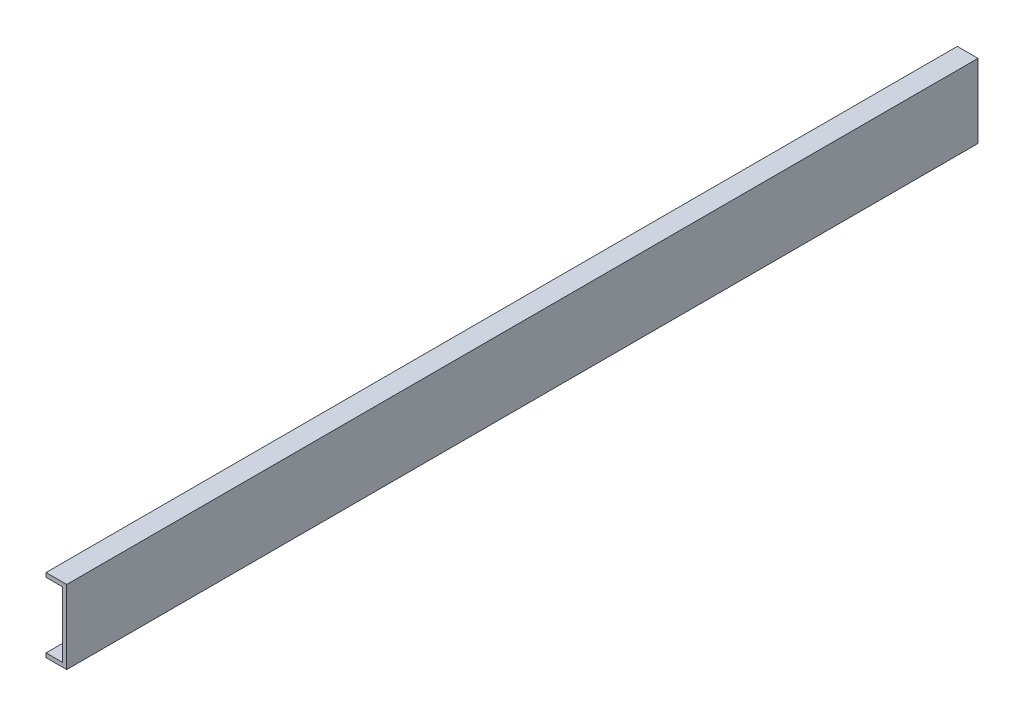
ISO-10303-21;
HEADER;
FILE_DESCRIPTION(('STEP AP214'),'2;1');
FILE_NAME('part.step','',(''),(''),'','','');
FILE_SCHEMA(('AUTOMOTIVE_DESIGN { 1 0 10303 214 1 1 1 1 }'));
ENDSEC;
DATA;
#1=APPLICATION_CONTEXT('core data for automotive mechanical design processes');
#2=APPLICATION_PROTOCOL_DEFINITION('international standard','automotive_design',2000,#1);
#3=PRODUCT_CONTEXT('',#1,'mechanical');
#4=PRODUCT('Part','Part','',(#3));
#5=PRODUCT_RELATED_PRODUCT_CATEGORY('part','',(#4));
#6=PRODUCT_DEFINITION_FORMATION('','',#4);
#7=PRODUCT_DEFINITION_CONTEXT('part definition',#1,'design');
#8=PRODUCT_DEFINITION('design','',#6,#7);
#9=PRODUCT_DEFINITION_SHAPE('','',#8);
#10=(LENGTH_UNIT() NAMED_UNIT(*) SI_UNIT(.MILLI.,.METRE.));
#11=(NAMED_UNIT(*) PLANE_ANGLE_UNIT() SI_UNIT($,.RADIAN.));
#12=(NAMED_UNIT(*) SI_UNIT($,.STERADIAN.) SOLID_ANGLE_UNIT());
#13=UNCERTAINTY_MEASURE_WITH_UNIT(LENGTH_MEASURE(1.E-05),#10,'distance_accuracy_value','');
#14=(GEOMETRIC_REPRESENTATION_CONTEXT(3) GLOBAL_UNCERTAINTY_ASSIGNED_CONTEXT((#13)) GLOBAL_UNIT_ASSIGNED_CONTEXT((#10,
#11,#12)) REPRESENTATION_CONTEXT('',''));
#15=CARTESIAN_POINT('',(0.,0.,0.));
#16=DIRECTION('',(0.,0.,1.));
#17=DIRECTION('',(1.,0.,0.));
#18=AXIS2_PLACEMENT_3D('',#15,#16,#17);
#19=CARTESIAN_POINT('',(-6.35,-22.606,558.8));
#20=DIRECTION('',(1.,0.,0.));
#21=DIRECTION('',(0.,0.,-1.));
#22=AXIS2_PLACEMENT_3D('',#19,#20,#21);
#23=PLANE('',#22);
#24=DIRECTION('',(0.,-1.,0.));
#25=VECTOR('',#24,1.);
#26=CARTESIAN_POINT('',(-6.35,-22.606,0.));
#27=LINE('',#26,#25);
#28=CARTESIAN_POINT('',(-6.35,22.606,0.));
#29=VERTEX_POINT('',#28);
#30=CARTESIAN_POINT('',(-6.35,20.066,0.));
#31=VERTEX_POINT('',#30);
#32=EDGE_CURVE('E131',#29,#31,#27,.T.);
#33=ORIENTED_EDGE('',*,*,#32,.T.);
#34=DIRECTION('',(0.,0.,1.));
#35=VECTOR('',#34,1.);
#36=CARTESIAN_POINT('',(-6.35,20.066,0.));
#37=LINE('',#36,#35);
#38=CARTESIAN_POINT('',(-6.35,20.066,558.8));
#39=VERTEX_POINT('',#38);
#40=EDGE_CURVE('E162',#31,#39,#37,.T.);
#41=ORIENTED_EDGE('',*,*,#40,.T.);
#42=DIRECTION('',(0.,-1.,0.));
#43=VECTOR('',#42,1.);
#44=CARTESIAN_POINT('',(-6.35,-22.606,558.8));
#45=LINE('',#44,#43);
#46=CARTESIAN_POINT('',(-6.35,22.606,558.8));
#47=VERTEX_POINT('',#46);
#48=EDGE_CURVE('E150',#47,#39,#45,.T.);
#49=ORIENTED_EDGE('',*,*,#48,.F.);
#50=DIRECTION('',(0.,0.,-1.));
#51=VECTOR('',#50,1.);
#52=CARTESIAN_POINT('',(-6.35,22.606,558.8));
#53=LINE('',#52,#51);
#54=EDGE_CURVE('E44',#47,#29,#53,.T.);
#55=ORIENTED_EDGE('',*,*,#54,.T.);
#56=EDGE_LOOP('',(#33,#41,#49,#55));
#57=FACE_BOUND('',#56,.T.);
#58=ADVANCED_FACE('F36',(#57),#23,.F.);
#59=CARTESIAN_POINT('',(6.35,-22.606,558.8));
#60=DIRECTION('',(-1.,0.,0.));
#61=DIRECTION('',(0.,0.,1.));
#62=AXIS2_PLACEMENT_3D('',#59,#60,#61);
#63=PLANE('',#62);
#64=DIRECTION('',(0.,1.,0.));
#65=VECTOR('',#64,1.);
#66=CARTESIAN_POINT('',(6.35,-22.606,0.));
#67=LINE('',#66,#65);
#68=CARTESIAN_POINT('',(6.35,-22.606,0.));
#69=VERTEX_POINT('',#68);
#70=CARTESIAN_POINT('',(6.35,22.606,0.));
#71=VERTEX_POINT('',#70);
#72=EDGE_CURVE('E135',#69,#71,#67,.T.);
#73=ORIENTED_EDGE('',*,*,#72,.T.);
#74=DIRECTION('',(0.,0.,-1.));
#75=VECTOR('',#74,1.);
#76=CARTESIAN_POINT('',(6.35,22.606,558.8));
#77=LINE('',#76,#75);
#78=CARTESIAN_POINT('',(6.35,22.606,558.8));
#79=VERTEX_POINT('',#78);
#80=EDGE_CURVE('E11',#79,#71,#77,.T.);
#81=ORIENTED_EDGE('',*,*,#80,.F.);
#82=DIRECTION('',(0.,1.,0.));
#83=VECTOR('',#82,1.);
#84=CARTESIAN_POINT('',(6.35,-22.606,558.8));
#85=LINE('',#84,#83);
#86=CARTESIAN_POINT('',(6.35,-22.606,558.8));
#87=VERTEX_POINT('',#86);
#88=EDGE_CURVE('E140',#87,#79,#85,.T.);
#89=ORIENTED_EDGE('',*,*,#88,.F.);
#90=DIRECTION('',(0.,0.,-1.));
#91=VECTOR('',#90,1.);
#92=CARTESIAN_POINT('',(6.35,-22.606,558.8));
#93=LINE('',#92,#91);
#94=EDGE_CURVE('E141',#87,#69,#93,.T.);
#95=ORIENTED_EDGE('',*,*,#94,.T.);
#96=EDGE_LOOP('',(#73,#81,#89,#95));
#97=FACE_BOUND('',#96,.T.);
#98=ADVANCED_FACE('F38',(#97),#63,.F.);
#99=CARTESIAN_POINT('',(-6.35,22.606,558.8));
#100=DIRECTION('',(0.,-1.,0.));
#101=DIRECTION('',(0.,0.,-1.));
#102=AXIS2_PLACEMENT_3D('',#99,#100,#101);
#103=PLANE('',#102);
#104=DIRECTION('',(-1.,0.,0.));
#105=VECTOR('',#104,1.);
#106=CARTESIAN_POINT('',(-6.35,22.606,0.));
#107=LINE('',#106,#105);
#108=EDGE_CURVE('E132',#71,#29,#107,.T.);
#109=ORIENTED_EDGE('',*,*,#108,.T.);
#110=ORIENTED_EDGE('',*,*,#54,.F.);
#111=DIRECTION('',(-1.,0.,0.));
#112=VECTOR('',#111,1.);
#113=CARTESIAN_POINT('',(-6.35,22.606,558.8));
#114=LINE('',#113,#112);
#115=EDGE_CURVE('E88',#79,#47,#114,.T.);
#116=ORIENTED_EDGE('',*,*,#115,.F.);
#117=ORIENTED_EDGE('',*,*,#80,.T.);
#118=EDGE_LOOP('',(#109,#110,#116,#117));
#119=FACE_BOUND('',#118,.T.);
#120=ADVANCED_FACE('F183',(#119),#103,.F.);
#121=CARTESIAN_POINT('',(-6.35,-20.066,558.8));
#122=VERTEX_POINT('',#121);
#123=CARTESIAN_POINT('',(-6.35,-22.606,558.8));
#124=VERTEX_POINT('',#123);
#125=EDGE_CURVE('E125',#122,#124,#45,.T.);
#126=ORIENTED_EDGE('',*,*,#125,.F.);
#127=DIRECTION('',(0.,0.,1.));
#128=VECTOR('',#127,1.);
#129=CARTESIAN_POINT('',(-6.35,-20.066,0.));
#130=LINE('',#129,#128);
#131=CARTESIAN_POINT('',(-6.35,-20.066,0.));
#132=VERTEX_POINT('',#131);
#133=EDGE_CURVE('E113',#132,#122,#130,.T.);
#134=ORIENTED_EDGE('',*,*,#133,.F.);
#135=CARTESIAN_POINT('',(-6.35,-22.606,0.));
#136=VERTEX_POINT('',#135);
#137=EDGE_CURVE('E124',#132,#136,#27,.T.);
#138=ORIENTED_EDGE('',*,*,#137,.T.);
#139=DIRECTION('',(0.,0.,-1.));
#140=VECTOR('',#139,1.);
#141=CARTESIAN_POINT('',(-6.35,-22.606,558.8));
#142=LINE('',#141,#140);
#143=EDGE_CURVE('E143',#124,#136,#142,.T.);
#144=ORIENTED_EDGE('',*,*,#143,.F.);
#145=EDGE_LOOP('',(#126,#134,#138,#144));
#146=FACE_BOUND('',#145,.T.);
#147=ADVANCED_FACE('F122',(#146),#23,.F.);
#148=CARTESIAN_POINT('',(-6.35,-22.606,558.8));
#149=DIRECTION('',(0.,1.,0.));
#150=DIRECTION('',(0.,0.,1.));
#151=AXIS2_PLACEMENT_3D('',#148,#149,#150);
#152=PLANE('',#151);
#153=DIRECTION('',(1.,0.,0.));
#154=VECTOR('',#153,1.);
#155=CARTESIAN_POINT('',(-6.35,-22.606,0.));
#156=LINE('',#155,#154);
#157=EDGE_CURVE('E81',#136,#69,#156,.T.);
#158=ORIENTED_EDGE('',*,*,#157,.T.);
#159=ORIENTED_EDGE('',*,*,#94,.F.);
#160=DIRECTION('',(1.,0.,0.));
#161=VECTOR('',#160,1.);
#162=CARTESIAN_POINT('',(-6.35,-22.606,558.8));
#163=LINE('',#162,#161);
#164=EDGE_CURVE('E60',#124,#87,#163,.T.);
#165=ORIENTED_EDGE('',*,*,#164,.F.);
#166=ORIENTED_EDGE('',*,*,#143,.T.);
#167=EDGE_LOOP('',(#158,#159,#165,#166));
#168=FACE_BOUND('',#167,.T.);
#169=ADVANCED_FACE('F174',(#168),#152,.F.);
#170=CARTESIAN_POINT('',(0.,0.,558.8));
#171=DIRECTION('',(0.,0.,-1.));
#172=DIRECTION('',(-1.,0.,0.));
#173=AXIS2_PLACEMENT_3D('',#170,#171,#172);
#174=PLANE('',#173);
#175=ORIENTED_EDGE('',*,*,#48,.T.);
#176=DIRECTION('',(-1.,0.,0.));
#177=VECTOR('',#176,1.);
#178=CARTESIAN_POINT('',(-6.35,20.066,558.8));
#179=LINE('',#178,#177);
#180=CARTESIAN_POINT('',(3.81,20.066,558.8));
#181=VERTEX_POINT('',#180);
#182=EDGE_CURVE('E118',#181,#39,#179,.T.);
#183=ORIENTED_EDGE('',*,*,#182,.F.);
#184=DIRECTION('',(0.,1.,0.));
#185=VECTOR('',#184,1.);
#186=CARTESIAN_POINT('',(3.81,20.066,558.8));
#187=LINE('',#186,#185);
#188=CARTESIAN_POINT('',(3.81,-20.066,558.8));
#189=VERTEX_POINT('',#188);
#190=EDGE_CURVE('E158',#189,#181,#187,.T.);
#191=ORIENTED_EDGE('',*,*,#190,.F.);
#192=DIRECTION('',(1.,0.,0.));
#193=VECTOR('',#192,1.);
#194=CARTESIAN_POINT('',(-6.35,-20.066,558.8));
#195=LINE('',#194,#193);
#196=EDGE_CURVE('E156',#122,#189,#195,.T.);
#197=ORIENTED_EDGE('',*,*,#196,.F.);
#198=ORIENTED_EDGE('',*,*,#125,.T.);
#199=ORIENTED_EDGE('',*,*,#164,.T.);
#200=ORIENTED_EDGE('',*,*,#88,.T.);
#201=ORIENTED_EDGE('',*,*,#115,.T.);
#202=EDGE_LOOP('',(#175,#183,#191,#197,#198,#199,#200,#201));
#203=FACE_BOUND('',#202,.T.);
#204=ADVANCED_FACE('F176',(#203),#174,.F.);
#205=CARTESIAN_POINT('',(0.,0.,0.));
#206=DIRECTION('',(0.,0.,-1.));
#207=DIRECTION('',(-1.,0.,0.));
#208=AXIS2_PLACEMENT_3D('',#205,#206,#207);
#209=PLANE('',#208);
#210=DIRECTION('',(-1.,0.,0.));
#211=VECTOR('',#210,1.);
#212=CARTESIAN_POINT('',(-6.35,20.066,0.));
#213=LINE('',#212,#211);
#214=CARTESIAN_POINT('',(3.81,20.066,0.));
#215=VERTEX_POINT('',#214);
#216=EDGE_CURVE('E126',#215,#31,#213,.T.);
#217=ORIENTED_EDGE('',*,*,#216,.T.);
#218=ORIENTED_EDGE('',*,*,#32,.F.);
#219=ORIENTED_EDGE('',*,*,#108,.F.);
#220=ORIENTED_EDGE('',*,*,#72,.F.);
#221=ORIENTED_EDGE('',*,*,#157,.F.);
#222=ORIENTED_EDGE('',*,*,#137,.F.);
#223=DIRECTION('',(1.,0.,0.));
#224=VECTOR('',#223,1.);
#225=CARTESIAN_POINT('',(-6.35,-20.066,0.));
#226=LINE('',#225,#224);
#227=CARTESIAN_POINT('',(3.81,-20.066,0.));
#228=VERTEX_POINT('',#227);
#229=EDGE_CURVE('E109',#132,#228,#226,.T.);
#230=ORIENTED_EDGE('',*,*,#229,.T.);
#231=DIRECTION('',(0.,1.,0.));
#232=VECTOR('',#231,1.);
#233=CARTESIAN_POINT('',(3.81,20.066,0.));
#234=LINE('',#233,#232);
#235=EDGE_CURVE('E51',#228,#215,#234,.T.);
#236=ORIENTED_EDGE('',*,*,#235,.T.);
#237=EDGE_LOOP('',(#217,#218,#219,#220,#221,#222,#230,#236));
#238=FACE_BOUND('',#237,.T.);
#239=ADVANCED_FACE('F129',(#238),#209,.T.);
#240=CARTESIAN_POINT('',(-6.35,20.066,0.));
#241=DIRECTION('',(0.,1.,0.));
#242=DIRECTION('',(0.,0.,1.));
#243=AXIS2_PLACEMENT_3D('',#240,#241,#242);
#244=PLANE('',#243);
#245=ORIENTED_EDGE('',*,*,#182,.T.);
#246=ORIENTED_EDGE('',*,*,#40,.F.);
#247=ORIENTED_EDGE('',*,*,#216,.F.);
#248=DIRECTION('',(0.,0.,1.));
#249=VECTOR('',#248,1.);
#250=CARTESIAN_POINT('',(3.81,20.066,0.));
#251=LINE('',#250,#249);
#252=EDGE_CURVE('E164',#215,#181,#251,.T.);
#253=ORIENTED_EDGE('',*,*,#252,.T.);
#254=EDGE_LOOP('',(#245,#246,#247,#253));
#255=FACE_BOUND('',#254,.T.);
#256=ADVANCED_FACE('F219',(#255),#244,.F.);
#257=CARTESIAN_POINT('',(3.81,20.066,0.));
#258=DIRECTION('',(1.,0.,0.));
#259=DIRECTION('',(0.,1.,0.));
#260=AXIS2_PLACEMENT_3D('',#257,#258,#259);
#261=PLANE('',#260);
#262=ORIENTED_EDGE('',*,*,#190,.T.);
#263=ORIENTED_EDGE('',*,*,#252,.F.);
#264=ORIENTED_EDGE('',*,*,#235,.F.);
#265=DIRECTION('',(0.,0.,1.));
#266=VECTOR('',#265,1.);
#267=CARTESIAN_POINT('',(3.81,-20.066,0.));
#268=LINE('',#267,#266);
#269=EDGE_CURVE('E115',#228,#189,#268,.T.);
#270=ORIENTED_EDGE('',*,*,#269,.T.);
#271=EDGE_LOOP('',(#262,#263,#264,#270));
#272=FACE_BOUND('',#271,.T.);
#273=ADVANCED_FACE('F229',(#272),#261,.F.);
#274=CARTESIAN_POINT('',(-6.35,-20.066,0.));
#275=DIRECTION('',(0.,-1.,0.));
#276=DIRECTION('',(0.,0.,-1.));
#277=AXIS2_PLACEMENT_3D('',#274,#275,#276);
#278=PLANE('',#277);
#279=ORIENTED_EDGE('',*,*,#196,.T.);
#280=ORIENTED_EDGE('',*,*,#269,.F.);
#281=ORIENTED_EDGE('',*,*,#229,.F.);
#282=ORIENTED_EDGE('',*,*,#133,.T.);
#283=EDGE_LOOP('',(#279,#280,#281,#282));
#284=FACE_BOUND('',#283,.T.);
#285=ADVANCED_FACE('F112',(#284),#278,.F.);
#286=CLOSED_SHELL('',(#58,#98,#120,#147,#169,#204,#239,#256,#273,#285));
#287=MANIFOLD_SOLID_BREP('B2',#286);
#288=ADVANCED_BREP_SHAPE_REPRESENTATION('',(#18,#287),#14);
#289=SHAPE_DEFINITION_REPRESENTATION(#9,#288);
ENDSEC;
END-ISO-10303-21;
